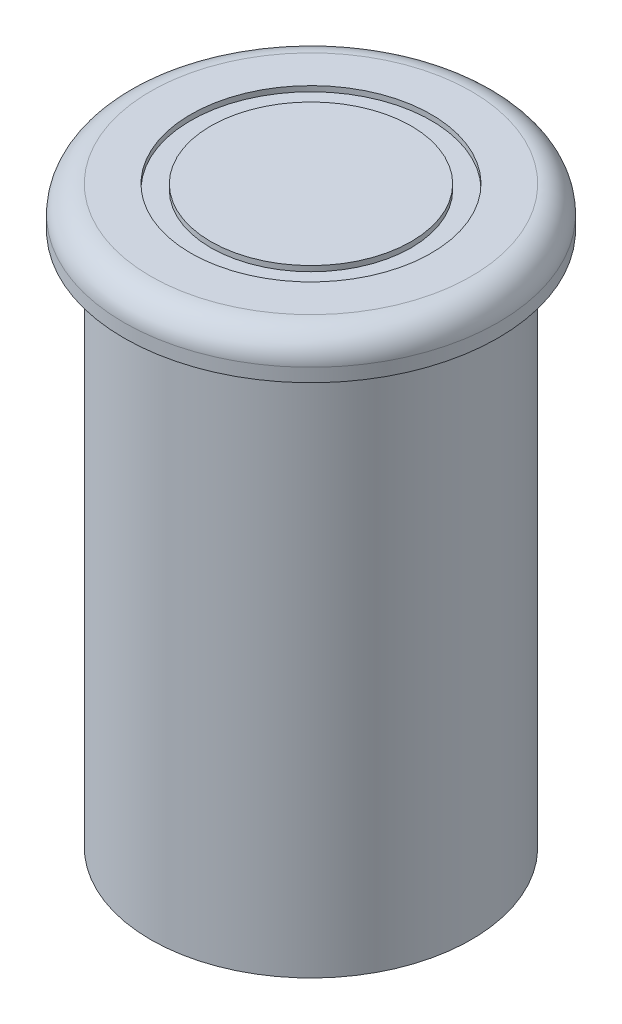
ISO-10303-21;
HEADER;
FILE_DESCRIPTION(('STEP AP214'),'2;1');
FILE_NAME('part.step','',(''),(''),'','','');
FILE_SCHEMA(('AUTOMOTIVE_DESIGN { 1 0 10303 214 1 1 1 1 }'));
ENDSEC;
DATA;
#1=APPLICATION_CONTEXT('core data for automotive mechanical design processes');
#2=APPLICATION_PROTOCOL_DEFINITION('international standard','automotive_design',2000,#1);
#3=PRODUCT_CONTEXT('',#1,'mechanical');
#4=PRODUCT('Part','Part','',(#3));
#5=PRODUCT_RELATED_PRODUCT_CATEGORY('part','',(#4));
#6=PRODUCT_DEFINITION_FORMATION('','',#4);
#7=PRODUCT_DEFINITION_CONTEXT('part definition',#1,'design');
#8=PRODUCT_DEFINITION('design','',#6,#7);
#9=PRODUCT_DEFINITION_SHAPE('','',#8);
#10=(LENGTH_UNIT() NAMED_UNIT(*) SI_UNIT(.MILLI.,.METRE.));
#11=(NAMED_UNIT(*) PLANE_ANGLE_UNIT() SI_UNIT($,.RADIAN.));
#12=(NAMED_UNIT(*) SI_UNIT($,.STERADIAN.) SOLID_ANGLE_UNIT());
#13=UNCERTAINTY_MEASURE_WITH_UNIT(LENGTH_MEASURE(1.E-05),#10,'distance_accuracy_value','');
#14=(GEOMETRIC_REPRESENTATION_CONTEXT(3) GLOBAL_UNCERTAINTY_ASSIGNED_CONTEXT((#13)) GLOBAL_UNIT_ASSIGNED_CONTEXT((#10,
#11,#12)) REPRESENTATION_CONTEXT('',''));
#15=CARTESIAN_POINT('',(0.,0.,0.));
#16=DIRECTION('',(0.,0.,1.));
#17=DIRECTION('',(1.,0.,0.));
#18=AXIS2_PLACEMENT_3D('',#15,#16,#17);
#19=CARTESIAN_POINT('',(0.,0.,0.));
#20=DIRECTION('',(0.,1.,0.));
#21=DIRECTION('',(0.,0.,1.));
#22=AXIS2_PLACEMENT_3D('',#19,#20,#21);
#23=PLANE('',#22);
#24=CARTESIAN_POINT('',(0.,0.,0.));
#25=DIRECTION('',(0.,1.,0.));
#26=DIRECTION('',(0.,0.,1.));
#27=AXIS2_PLACEMENT_3D('',#24,#25,#26);
#28=CIRCLE('',#27,4.5);
#29=CARTESIAN_POINT('',(0.,0.,4.5));
#30=VERTEX_POINT('',#29);
#31=EDGE_CURVE('E54',#30,#30,#28,.T.);
#32=ORIENTED_EDGE('',*,*,#31,.F.);
#33=EDGE_LOOP('',(#32));
#34=FACE_BOUND('',#33,.T.);
#35=CARTESIAN_POINT('',(0.,0.,0.));
#36=DIRECTION('',(0.,1.,0.));
#37=DIRECTION('',(0.,0.,1.));
#38=AXIS2_PLACEMENT_3D('',#35,#36,#37);
#39=CIRCLE('',#38,6.);
#40=CARTESIAN_POINT('',(0.,0.,6.));
#41=VERTEX_POINT('',#40);
#42=EDGE_CURVE('E10',#41,#41,#39,.T.);
#43=ORIENTED_EDGE('',*,*,#42,.T.);
#44=EDGE_LOOP('',(#43));
#45=FACE_BOUND('',#44,.T.);
#46=ADVANCED_FACE('F30',(#34,#45),#23,.T.);
#47=CARTESIAN_POINT('',(0.,0.,0.));
#48=DIRECTION('',(0.,-1.,0.));
#49=DIRECTION('',(0.,0.,-1.));
#50=AXIS2_PLACEMENT_3D('',#47,#48,#49);
#51=CYLINDRICAL_SURFACE('',#50,7.);
#52=CARTESIAN_POINT('',(0.,-1.,0.));
#53=DIRECTION('',(0.,1.,0.));
#54=DIRECTION('',(0.,0.,1.));
#55=AXIS2_PLACEMENT_3D('',#52,#53,#54);
#56=CIRCLE('',#55,7.);
#57=CARTESIAN_POINT('',(0.,-1.,7.));
#58=VERTEX_POINT('',#57);
#59=EDGE_CURVE('E37',#58,#58,#56,.F.);
#60=ORIENTED_EDGE('',*,*,#59,.T.);
#61=EDGE_LOOP('',(#60));
#62=FACE_BOUND('',#61,.T.);
#63=CARTESIAN_POINT('',(0.,-1.5,0.));
#64=DIRECTION('',(0.,-1.,0.));
#65=DIRECTION('',(0.,0.,-1.));
#66=AXIS2_PLACEMENT_3D('',#63,#64,#65);
#67=CIRCLE('',#66,7.);
#68=CARTESIAN_POINT('',(0.,-1.5,-7.));
#69=VERTEX_POINT('',#68);
#70=EDGE_CURVE('E41',#69,#69,#67,.T.);
#71=ORIENTED_EDGE('',*,*,#70,.F.);
#72=EDGE_LOOP('',(#71));
#73=FACE_BOUND('',#72,.T.);
#74=ADVANCED_FACE('F82',(#62,#73),#51,.T.);
#75=CARTESIAN_POINT('',(7.,-1.5,0.));
#76=DIRECTION('',(0.,-1.,0.));
#77=DIRECTION('',(0.,0.,-1.));
#78=AXIS2_PLACEMENT_3D('',#75,#76,#77);
#79=PLANE('',#78);
#80=ORIENTED_EDGE('',*,*,#70,.T.);
#81=EDGE_LOOP('',(#80));
#82=FACE_BOUND('',#81,.T.);
#83=CARTESIAN_POINT('',(0.,-1.5,0.));
#84=DIRECTION('',(0.,-1.,0.));
#85=DIRECTION('',(0.,0.,-1.));
#86=AXIS2_PLACEMENT_3D('',#83,#84,#85);
#87=CIRCLE('',#86,6.);
#88=CARTESIAN_POINT('',(0.,-1.5,-6.));
#89=VERTEX_POINT('',#88);
#90=EDGE_CURVE('E45',#89,#89,#87,.T.);
#91=ORIENTED_EDGE('',*,*,#90,.F.);
#92=EDGE_LOOP('',(#91));
#93=FACE_BOUND('',#92,.T.);
#94=ADVANCED_FACE('F87',(#82,#93),#79,.T.);
#95=CARTESIAN_POINT('',(0.,0.,0.));
#96=DIRECTION('',(0.,-1.,0.));
#97=DIRECTION('',(0.,0.,-1.));
#98=AXIS2_PLACEMENT_3D('',#95,#96,#97);
#99=CYLINDRICAL_SURFACE('',#98,6.);
#100=ORIENTED_EDGE('',*,*,#90,.T.);
#101=EDGE_LOOP('',(#100));
#102=FACE_BOUND('',#101,.T.);
#103=CARTESIAN_POINT('',(0.,-21.5,0.));
#104=DIRECTION('',(0.,-1.,0.));
#105=DIRECTION('',(0.,0.,-1.));
#106=AXIS2_PLACEMENT_3D('',#103,#104,#105);
#107=CIRCLE('',#106,6.);
#108=CARTESIAN_POINT('',(0.,-21.5,-6.));
#109=VERTEX_POINT('',#108);
#110=EDGE_CURVE('E50',#109,#109,#107,.T.);
#111=ORIENTED_EDGE('',*,*,#110,.F.);
#112=EDGE_LOOP('',(#111));
#113=FACE_BOUND('',#112,.T.);
#114=ADVANCED_FACE('F102',(#102,#113),#99,.T.);
#115=CARTESIAN_POINT('',(6.,-21.5,0.));
#116=DIRECTION('',(0.,-1.,0.));
#117=DIRECTION('',(0.,0.,-1.));
#118=AXIS2_PLACEMENT_3D('',#115,#116,#117);
#119=PLANE('',#118);
#120=ORIENTED_EDGE('',*,*,#110,.T.);
#121=EDGE_LOOP('',(#120));
#122=FACE_BOUND('',#121,.T.);
#123=ADVANCED_FACE('F99',(#122),#119,.T.);
#124=CARTESIAN_POINT('',(0.,-1.,0.));
#125=DIRECTION('',(0.,1.,0.));
#126=DIRECTION('',(0.,0.,1.));
#127=AXIS2_PLACEMENT_3D('',#124,#125,#126);
#128=TOROIDAL_SURFACE('',#127,6.,1.);
#129=ORIENTED_EDGE('',*,*,#42,.F.);
#130=EDGE_LOOP('',(#129));
#131=FACE_BOUND('',#130,.T.);
#132=ORIENTED_EDGE('',*,*,#59,.F.);
#133=EDGE_LOOP('',(#132));
#134=FACE_BOUND('',#133,.T.);
#135=ADVANCED_FACE('F32',(#131,#134),#128,.T.);
#136=CARTESIAN_POINT('',(0.,-0.2,0.));
#137=DIRECTION('',(0.,1.,0.));
#138=DIRECTION('',(0.,0.,1.));
#139=AXIS2_PLACEMENT_3D('',#136,#137,#138);
#140=CYLINDRICAL_SURFACE('',#139,4.5);
#141=CARTESIAN_POINT('',(0.,-0.2,0.));
#142=DIRECTION('',(0.,1.,0.));
#143=DIRECTION('',(0.,0.,1.));
#144=AXIS2_PLACEMENT_3D('',#141,#142,#143);
#145=CIRCLE('',#144,4.5);
#146=CARTESIAN_POINT('',(0.,-0.2,4.5));
#147=VERTEX_POINT('',#146);
#148=EDGE_CURVE('E53',#147,#147,#145,.T.);
#149=ORIENTED_EDGE('',*,*,#148,.F.);
#150=EDGE_LOOP('',(#149));
#151=FACE_BOUND('',#150,.T.);
#152=ORIENTED_EDGE('',*,*,#31,.T.);
#153=EDGE_LOOP('',(#152));
#154=FACE_BOUND('',#153,.T.);
#155=ADVANCED_FACE('F72',(#151,#154),#140,.F.);
#156=CARTESIAN_POINT('',(0.,-0.2,0.));
#157=DIRECTION('',(0.,1.,0.));
#158=DIRECTION('',(0.,0.,1.));
#159=AXIS2_PLACEMENT_3D('',#156,#157,#158);
#160=PLANE('',#159);
#161=CARTESIAN_POINT('',(0.,-0.2,0.));
#162=DIRECTION('',(0.,1.,0.));
#163=DIRECTION('',(0.,0.,1.));
#164=AXIS2_PLACEMENT_3D('',#161,#162,#163);
#165=CIRCLE('',#164,3.75);
#166=CARTESIAN_POINT('',(0.,-0.2,3.75));
#167=VERTEX_POINT('',#166);
#168=EDGE_CURVE('E57',#167,#167,#165,.T.);
#169=ORIENTED_EDGE('',*,*,#168,.F.);
#170=EDGE_LOOP('',(#169));
#171=FACE_BOUND('',#170,.T.);
#172=ORIENTED_EDGE('',*,*,#148,.T.);
#173=EDGE_LOOP('',(#172));
#174=FACE_BOUND('',#173,.T.);
#175=ADVANCED_FACE('F69',(#171,#174),#160,.T.);
#176=CARTESIAN_POINT('',(0.,-0.2,0.));
#177=DIRECTION('',(0.,1.,0.));
#178=DIRECTION('',(0.,0.,1.));
#179=AXIS2_PLACEMENT_3D('',#176,#177,#178);
#180=CYLINDRICAL_SURFACE('',#179,3.75);
#181=ORIENTED_EDGE('',*,*,#168,.T.);
#182=EDGE_LOOP('',(#181));
#183=FACE_BOUND('',#182,.T.);
#184=CARTESIAN_POINT('',(0.,0.,0.));
#185=DIRECTION('',(0.,1.,0.));
#186=DIRECTION('',(0.,0.,1.));
#187=AXIS2_PLACEMENT_3D('',#184,#185,#186);
#188=CIRCLE('',#187,3.75);
#189=CARTESIAN_POINT('',(0.,0.,3.75));
#190=VERTEX_POINT('',#189);
#191=EDGE_CURVE('E60',#190,#190,#188,.T.);
#192=ORIENTED_EDGE('',*,*,#191,.F.);
#193=EDGE_LOOP('',(#192));
#194=FACE_BOUND('',#193,.T.);
#195=ADVANCED_FACE('F66',(#183,#194),#180,.T.);
#196=ORIENTED_EDGE('',*,*,#191,.T.);
#197=EDGE_LOOP('',(#196));
#198=FACE_BOUND('',#197,.T.);
#199=ADVANCED_FACE('F83',(#198),#23,.T.);
#200=CLOSED_SHELL('',(#46,#74,#94,#114,#123,#135,#155,#175,#195,#199));
#201=MANIFOLD_SOLID_BREP('B2',#200);
#202=ADVANCED_BREP_SHAPE_REPRESENTATION('',(#18,#201),#14);
#203=SHAPE_DEFINITION_REPRESENTATION(#9,#202);
ENDSEC;
END-ISO-10303-21;
